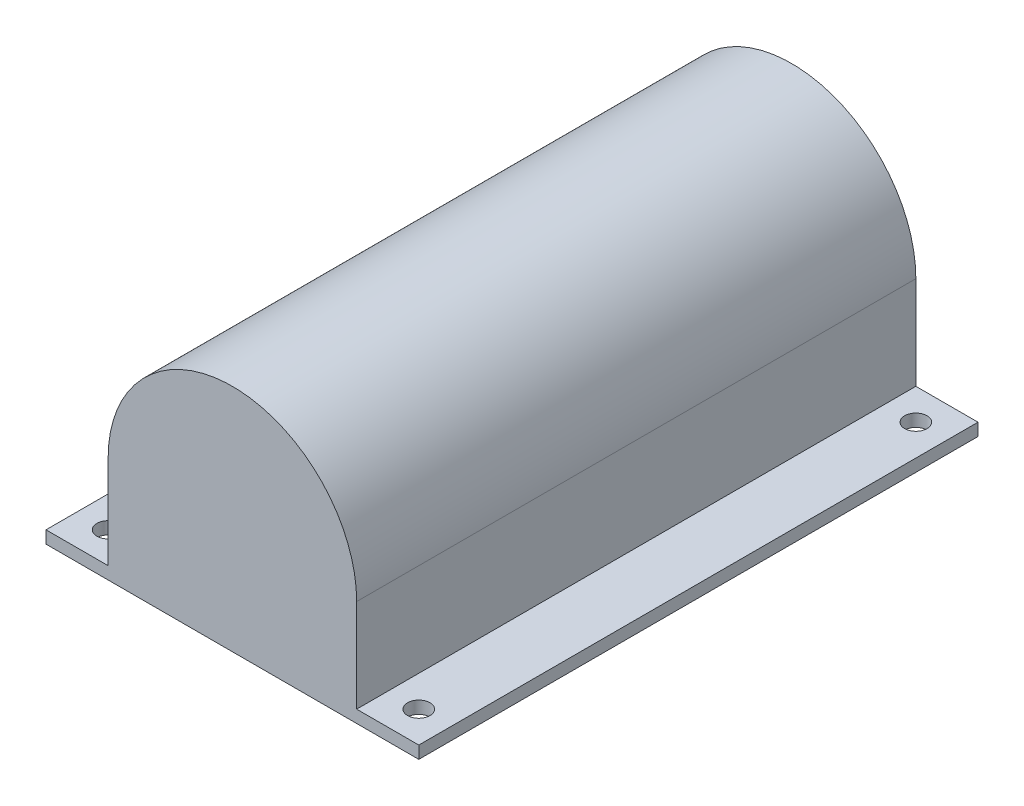
ISO-10303-21;
HEADER;
FILE_DESCRIPTION(('STEP AP214'),'2;1');
FILE_NAME('part.step','',(''),(''),'','','');
FILE_SCHEMA(('AUTOMOTIVE_DESIGN { 1 0 10303 214 1 1 1 1 }'));
ENDSEC;
DATA;
#1=APPLICATION_CONTEXT('core data for automotive mechanical design processes');
#2=APPLICATION_PROTOCOL_DEFINITION('international standard','automotive_design',2000,#1);
#3=PRODUCT_CONTEXT('',#1,'mechanical');
#4=PRODUCT('Part','Part','',(#3));
#5=PRODUCT_RELATED_PRODUCT_CATEGORY('part','',(#4));
#6=PRODUCT_DEFINITION_FORMATION('','',#4);
#7=PRODUCT_DEFINITION_CONTEXT('part definition',#1,'design');
#8=PRODUCT_DEFINITION('design','',#6,#7);
#9=PRODUCT_DEFINITION_SHAPE('','',#8);
#10=(LENGTH_UNIT() NAMED_UNIT(*) SI_UNIT(.MILLI.,.METRE.));
#11=(NAMED_UNIT(*) PLANE_ANGLE_UNIT() SI_UNIT($,.RADIAN.));
#12=(NAMED_UNIT(*) SI_UNIT($,.STERADIAN.) SOLID_ANGLE_UNIT());
#13=UNCERTAINTY_MEASURE_WITH_UNIT(LENGTH_MEASURE(1.E-05),#10,'distance_accuracy_value','');
#14=(GEOMETRIC_REPRESENTATION_CONTEXT(3) GLOBAL_UNCERTAINTY_ASSIGNED_CONTEXT((#13)) GLOBAL_UNIT_ASSIGNED_CONTEXT((#10,
#11,#12)) REPRESENTATION_CONTEXT('',''));
#15=CARTESIAN_POINT('',(0.,0.,0.));
#16=DIRECTION('',(0.,0.,1.));
#17=DIRECTION('',(1.,0.,0.));
#18=AXIS2_PLACEMENT_3D('',#15,#16,#17);
#19=CARTESIAN_POINT('',(0.,2.54,114.3));
#20=DIRECTION('',(0.,1.,0.));
#21=DIRECTION('',(0.,0.,1.));
#22=AXIS2_PLACEMENT_3D('',#19,#20,#21);
#23=PLANE('',#22);
#24=CARTESIAN_POINT('',(6.35,2.54,25.4));
#25=DIRECTION('',(0.,1.,0.));
#26=DIRECTION('',(0.,0.,1.));
#27=AXIS2_PLACEMENT_3D('',#24,#25,#26);
#28=CIRCLE('',#27,3.175);
#29=CARTESIAN_POINT('',(6.35,2.54,28.575));
#30=VERTEX_POINT('',#29);
#31=EDGE_CURVE('E274',#30,#30,#28,.T.);
#32=ORIENTED_EDGE('',*,*,#31,.F.);
#33=EDGE_LOOP('',(#32));
#34=FACE_BOUND('',#33,.T.);
#35=CARTESIAN_POINT('',(6.35,2.54,78.74));
#36=DIRECTION('',(0.,1.,0.));
#37=DIRECTION('',(0.,0.,1.));
#38=AXIS2_PLACEMENT_3D('',#35,#36,#37);
#39=CIRCLE('',#38,2.49999995300001);
#40=CARTESIAN_POINT('',(6.35,2.54,81.239999953));
#41=VERTEX_POINT('',#40);
#42=EDGE_CURVE('E293',#41,#41,#39,.T.);
#43=ORIENTED_EDGE('',*,*,#42,.F.);
#44=EDGE_LOOP('',(#43));
#45=FACE_BOUND('',#44,.T.);
#46=CARTESIAN_POINT('',(6.35,2.54,68.58));
#47=DIRECTION('',(0.,1.,0.));
#48=DIRECTION('',(0.,0.,1.));
#49=AXIS2_PLACEMENT_3D('',#46,#47,#48);
#50=CIRCLE('',#49,2.49999995300001);
#51=CARTESIAN_POINT('',(6.35,2.54,71.079999953));
#52=VERTEX_POINT('',#51);
#53=EDGE_CURVE('E290',#52,#52,#50,.T.);
#54=ORIENTED_EDGE('',*,*,#53,.F.);
#55=EDGE_LOOP('',(#54));
#56=FACE_BOUND('',#55,.T.);
#57=CARTESIAN_POINT('',(6.35,2.54,58.42));
#58=DIRECTION('',(0.,1.,0.));
#59=DIRECTION('',(0.,0.,1.));
#60=AXIS2_PLACEMENT_3D('',#57,#58,#59);
#61=CIRCLE('',#60,2.499999953);
#62=CARTESIAN_POINT('',(6.35,2.54,60.919999953));
#63=VERTEX_POINT('',#62);
#64=EDGE_CURVE('E282',#63,#63,#61,.T.);
#65=ORIENTED_EDGE('',*,*,#64,.F.);
#66=EDGE_LOOP('',(#65));
#67=FACE_BOUND('',#66,.T.);
#68=CARTESIAN_POINT('',(6.35,2.54,88.9));
#69=DIRECTION('',(0.,1.,0.));
#70=DIRECTION('',(0.,0.,1.));
#71=AXIS2_PLACEMENT_3D('',#68,#69,#70);
#72=CIRCLE('',#71,2.499999953);
#73=CARTESIAN_POINT('',(6.35,2.54,91.399999953));
#74=VERTEX_POINT('',#73);
#75=EDGE_CURVE('E299',#74,#74,#72,.T.);
#76=ORIENTED_EDGE('',*,*,#75,.F.);
#77=EDGE_LOOP('',(#76));
#78=FACE_BOUND('',#77,.T.);
#79=CARTESIAN_POINT('',(6.35,2.54,107.95));
#80=DIRECTION('',(0.,1.,0.));
#81=DIRECTION('',(0.,0.,1.));
#82=AXIS2_PLACEMENT_3D('',#79,#80,#81);
#83=CIRCLE('',#82,2.286);
#84=CARTESIAN_POINT('',(6.35,2.54,110.236));
#85=VERTEX_POINT('',#84);
#86=EDGE_CURVE('E327',#85,#85,#83,.T.);
#87=ORIENTED_EDGE('',*,*,#86,.F.);
#88=EDGE_LOOP('',(#87));
#89=FACE_BOUND('',#88,.T.);
#90=CARTESIAN_POINT('',(6.35,2.54,6.34999999999999));
#91=DIRECTION('',(0.,1.,0.));
#92=DIRECTION('',(0.,0.,1.));
#93=AXIS2_PLACEMENT_3D('',#90,#91,#92);
#94=CIRCLE('',#93,2.286);
#95=CARTESIAN_POINT('',(6.35,2.54,8.63599999999999));
#96=VERTEX_POINT('',#95);
#97=EDGE_CURVE('E338',#96,#96,#94,.T.);
#98=ORIENTED_EDGE('',*,*,#97,.F.);
#99=EDGE_LOOP('',(#98));
#100=FACE_BOUND('',#99,.T.);
#101=DIRECTION('',(1.,0.,0.));
#102=VECTOR('',#101,1.);
#103=CARTESIAN_POINT('',(0.,2.54,0.));
#104=LINE('',#103,#102);
#105=CARTESIAN_POINT('',(0.,2.54,0.));
#106=VERTEX_POINT('',#105);
#107=CARTESIAN_POINT('',(12.7,2.54,0.));
#108=VERTEX_POINT('',#107);
#109=EDGE_CURVE('E143',#106,#108,#104,.T.);
#110=ORIENTED_EDGE('',*,*,#109,.F.);
#111=DIRECTION('',(0.,0.,-1.));
#112=VECTOR('',#111,1.);
#113=CARTESIAN_POINT('',(0.,2.54,114.3));
#114=LINE('',#113,#112);
#115=CARTESIAN_POINT('',(0.,2.54,114.3));
#116=VERTEX_POINT('',#115);
#117=EDGE_CURVE('E11',#116,#106,#114,.T.);
#118=ORIENTED_EDGE('',*,*,#117,.F.);
#119=DIRECTION('',(1.,0.,0.));
#120=VECTOR('',#119,1.);
#121=CARTESIAN_POINT('',(0.,2.54,114.3));
#122=LINE('',#121,#120);
#123=CARTESIAN_POINT('',(12.7,2.54,114.3));
#124=VERTEX_POINT('',#123);
#125=EDGE_CURVE('E164',#116,#124,#122,.T.);
#126=ORIENTED_EDGE('',*,*,#125,.T.);
#127=DIRECTION('',(0.,0.,-1.));
#128=VECTOR('',#127,1.);
#129=CARTESIAN_POINT('',(12.7,2.54,114.3));
#130=LINE('',#129,#128);
#131=EDGE_CURVE('E36',#124,#108,#130,.T.);
#132=ORIENTED_EDGE('',*,*,#131,.T.);
#133=EDGE_LOOP('',(#110,#118,#126,#132));
#134=FACE_BOUND('',#133,.T.);
#135=ADVANCED_FACE('F33',(#34,#45,#56,#67,#78,#89,#100,#134),#23,.T.);
#136=CARTESIAN_POINT('',(0.,0.,114.3));
#137=DIRECTION('',(-1.,0.,0.));
#138=DIRECTION('',(0.,0.,1.));
#139=AXIS2_PLACEMENT_3D('',#136,#137,#138);
#140=PLANE('',#139);
#141=DIRECTION('',(0.,1.,0.));
#142=VECTOR('',#141,1.);
#143=CARTESIAN_POINT('',(0.,0.,0.));
#144=LINE('',#143,#142);
#145=CARTESIAN_POINT('',(0.,0.,0.));
#146=VERTEX_POINT('',#145);
#147=EDGE_CURVE('E162',#146,#106,#144,.T.);
#148=ORIENTED_EDGE('',*,*,#147,.F.);
#149=DIRECTION('',(0.,0.,-1.));
#150=VECTOR('',#149,1.);
#151=CARTESIAN_POINT('',(0.,0.,114.3));
#152=LINE('',#151,#150);
#153=CARTESIAN_POINT('',(0.,0.,114.3));
#154=VERTEX_POINT('',#153);
#155=EDGE_CURVE('E41',#154,#146,#152,.T.);
#156=ORIENTED_EDGE('',*,*,#155,.F.);
#157=DIRECTION('',(0.,1.,0.));
#158=VECTOR('',#157,1.);
#159=CARTESIAN_POINT('',(0.,0.,114.3));
#160=LINE('',#159,#158);
#161=EDGE_CURVE('E121',#154,#116,#160,.T.);
#162=ORIENTED_EDGE('',*,*,#161,.T.);
#163=ORIENTED_EDGE('',*,*,#117,.T.);
#164=EDGE_LOOP('',(#148,#156,#162,#163));
#165=FACE_BOUND('',#164,.T.);
#166=ADVANCED_FACE('F177',(#165),#140,.T.);
#167=CARTESIAN_POINT('',(0.,0.,114.3));
#168=DIRECTION('',(0.,1.,0.));
#169=DIRECTION('',(0.,0.,1.));
#170=AXIS2_PLACEMENT_3D('',#167,#168,#169);
#171=PLANE('',#170);
#172=CARTESIAN_POINT('',(6.35,0.,25.4));
#173=DIRECTION('',(0.,1.,0.));
#174=DIRECTION('',(0.,0.,1.));
#175=AXIS2_PLACEMENT_3D('',#172,#173,#174);
#176=CIRCLE('',#175,3.175);
#177=CARTESIAN_POINT('',(6.35,0.,28.575));
#178=VERTEX_POINT('',#177);
#179=EDGE_CURVE('E271',#178,#178,#176,.T.);
#180=ORIENTED_EDGE('',*,*,#179,.T.);
#181=EDGE_LOOP('',(#180));
#182=FACE_BOUND('',#181,.T.);
#183=CARTESIAN_POINT('',(6.35,0.,78.74));
#184=DIRECTION('',(0.,-1.,0.));
#185=DIRECTION('',(0.,0.,-1.));
#186=AXIS2_PLACEMENT_3D('',#183,#184,#185);
#187=CIRCLE('',#186,2.49999995300001);
#188=CARTESIAN_POINT('',(6.35,0.,76.240000047));
#189=VERTEX_POINT('',#188);
#190=EDGE_CURVE('E279',#189,#189,#187,.T.);
#191=ORIENTED_EDGE('',*,*,#190,.F.);
#192=EDGE_LOOP('',(#191));
#193=FACE_BOUND('',#192,.T.);
#194=CARTESIAN_POINT('',(6.35,0.,68.58));
#195=DIRECTION('',(0.,-1.,0.));
#196=DIRECTION('',(0.,0.,-1.));
#197=AXIS2_PLACEMENT_3D('',#194,#195,#196);
#198=CIRCLE('',#197,2.49999995300001);
#199=CARTESIAN_POINT('',(6.35,0.,66.080000047));
#200=VERTEX_POINT('',#199);
#201=EDGE_CURVE('E283',#200,#200,#198,.T.);
#202=ORIENTED_EDGE('',*,*,#201,.F.);
#203=EDGE_LOOP('',(#202));
#204=FACE_BOUND('',#203,.T.);
#205=CARTESIAN_POINT('',(6.35,0.,58.42));
#206=DIRECTION('',(0.,-1.,0.));
#207=DIRECTION('',(0.,0.,-1.));
#208=AXIS2_PLACEMENT_3D('',#205,#206,#207);
#209=CIRCLE('',#208,2.499999953);
#210=CARTESIAN_POINT('',(6.35,0.,55.920000047));
#211=VERTEX_POINT('',#210);
#212=EDGE_CURVE('E276',#211,#211,#209,.T.);
#213=ORIENTED_EDGE('',*,*,#212,.F.);
#214=EDGE_LOOP('',(#213));
#215=FACE_BOUND('',#214,.T.);
#216=CARTESIAN_POINT('',(6.35,0.,88.9));
#217=DIRECTION('',(0.,-1.,0.));
#218=DIRECTION('',(0.,0.,-1.));
#219=AXIS2_PLACEMENT_3D('',#216,#217,#218);
#220=CIRCLE('',#219,2.499999953);
#221=CARTESIAN_POINT('',(6.35,0.,86.400000047));
#222=VERTEX_POINT('',#221);
#223=EDGE_CURVE('E296',#222,#222,#220,.T.);
#224=ORIENTED_EDGE('',*,*,#223,.F.);
#225=EDGE_LOOP('',(#224));
#226=FACE_BOUND('',#225,.T.);
#227=CARTESIAN_POINT('',(69.85,0.,6.34999999999999));
#228=DIRECTION('',(0.,1.,0.));
#229=DIRECTION('',(0.,0.,1.));
#230=AXIS2_PLACEMENT_3D('',#227,#228,#229);
#231=CIRCLE('',#230,2.28599999999999);
#232=CARTESIAN_POINT('',(69.85,0.,8.63599999999999));
#233=VERTEX_POINT('',#232);
#234=EDGE_CURVE('E335',#233,#233,#231,.T.);
#235=ORIENTED_EDGE('',*,*,#234,.T.);
#236=EDGE_LOOP('',(#235));
#237=FACE_BOUND('',#236,.T.);
#238=CARTESIAN_POINT('',(69.85,0.,107.95));
#239=DIRECTION('',(0.,1.,0.));
#240=DIRECTION('',(0.,0.,1.));
#241=AXIS2_PLACEMENT_3D('',#238,#239,#240);
#242=CIRCLE('',#241,2.28599999999999);
#243=CARTESIAN_POINT('',(69.85,0.,110.236));
#244=VERTEX_POINT('',#243);
#245=EDGE_CURVE('E342',#244,#244,#242,.T.);
#246=ORIENTED_EDGE('',*,*,#245,.T.);
#247=EDGE_LOOP('',(#246));
#248=FACE_BOUND('',#247,.T.);
#249=CARTESIAN_POINT('',(6.35,0.,107.95));
#250=DIRECTION('',(0.,1.,0.));
#251=DIRECTION('',(0.,0.,1.));
#252=AXIS2_PLACEMENT_3D('',#249,#250,#251);
#253=CIRCLE('',#252,2.286);
#254=CARTESIAN_POINT('',(6.35,0.,110.236));
#255=VERTEX_POINT('',#254);
#256=EDGE_CURVE('E348',#255,#255,#253,.T.);
#257=ORIENTED_EDGE('',*,*,#256,.T.);
#258=EDGE_LOOP('',(#257));
#259=FACE_BOUND('',#258,.T.);
#260=CARTESIAN_POINT('',(6.35,0.,6.34999999999999));
#261=DIRECTION('',(0.,1.,0.));
#262=DIRECTION('',(0.,0.,1.));
#263=AXIS2_PLACEMENT_3D('',#260,#261,#262);
#264=CIRCLE('',#263,2.286);
#265=CARTESIAN_POINT('',(6.35,0.,8.63599999999999));
#266=VERTEX_POINT('',#265);
#267=EDGE_CURVE('E147',#266,#266,#264,.T.);
#268=ORIENTED_EDGE('',*,*,#267,.T.);
#269=EDGE_LOOP('',(#268));
#270=FACE_BOUND('',#269,.T.);
#271=DIRECTION('',(1.,0.,0.));
#272=VECTOR('',#271,1.);
#273=CARTESIAN_POINT('',(0.,0.,0.));
#274=LINE('',#273,#272);
#275=CARTESIAN_POINT('',(76.2,0.,0.));
#276=VERTEX_POINT('',#275);
#277=EDGE_CURVE('E128',#146,#276,#274,.T.);
#278=ORIENTED_EDGE('',*,*,#277,.T.);
#279=DIRECTION('',(0.,0.,-1.));
#280=VECTOR('',#279,1.);
#281=CARTESIAN_POINT('',(76.2,0.,114.3));
#282=LINE('',#281,#280);
#283=CARTESIAN_POINT('',(76.2,0.,114.3));
#284=VERTEX_POINT('',#283);
#285=EDGE_CURVE('E125',#284,#276,#282,.T.);
#286=ORIENTED_EDGE('',*,*,#285,.F.);
#287=DIRECTION('',(1.,0.,0.));
#288=VECTOR('',#287,1.);
#289=CARTESIAN_POINT('',(0.,0.,114.3));
#290=LINE('',#289,#288);
#291=EDGE_CURVE('E114',#154,#284,#290,.T.);
#292=ORIENTED_EDGE('',*,*,#291,.F.);
#293=ORIENTED_EDGE('',*,*,#155,.T.);
#294=EDGE_LOOP('',(#278,#286,#292,#293));
#295=FACE_BOUND('',#294,.T.);
#296=ADVANCED_FACE('F126',(#182,#193,#204,#215,#226,#237,#248,#259,#270,#295),#171,.F.);
#297=CARTESIAN_POINT('',(76.2,0.,114.3));
#298=DIRECTION('',(-1.,0.,0.));
#299=DIRECTION('',(0.,0.,1.));
#300=AXIS2_PLACEMENT_3D('',#297,#298,#299);
#301=PLANE('',#300);
#302=DIRECTION('',(0.,1.,0.));
#303=VECTOR('',#302,1.);
#304=CARTESIAN_POINT('',(76.2,0.,0.));
#305=LINE('',#304,#303);
#306=CARTESIAN_POINT('',(76.2,2.54,0.));
#307=VERTEX_POINT('',#306);
#308=EDGE_CURVE('E159',#276,#307,#305,.T.);
#309=ORIENTED_EDGE('',*,*,#308,.T.);
#310=DIRECTION('',(0.,0.,-1.));
#311=VECTOR('',#310,1.);
#312=CARTESIAN_POINT('',(76.2,2.54,114.3));
#313=LINE('',#312,#311);
#314=CARTESIAN_POINT('',(76.2,2.54,114.3));
#315=VERTEX_POINT('',#314);
#316=EDGE_CURVE('E132',#315,#307,#313,.T.);
#317=ORIENTED_EDGE('',*,*,#316,.F.);
#318=DIRECTION('',(0.,1.,0.));
#319=VECTOR('',#318,1.);
#320=CARTESIAN_POINT('',(76.2,0.,114.3));
#321=LINE('',#320,#319);
#322=EDGE_CURVE('E119',#284,#315,#321,.T.);
#323=ORIENTED_EDGE('',*,*,#322,.F.);
#324=ORIENTED_EDGE('',*,*,#285,.T.);
#325=EDGE_LOOP('',(#309,#317,#323,#324));
#326=FACE_BOUND('',#325,.T.);
#327=ADVANCED_FACE('F134',(#326),#301,.F.);
#328=CARTESIAN_POINT('',(63.5,2.54,114.3));
#329=DIRECTION('',(0.,1.,0.));
#330=DIRECTION('',(-1.,0.,0.));
#331=AXIS2_PLACEMENT_3D('',#328,#329,#330);
#332=PLANE('',#331);
#333=CARTESIAN_POINT('',(69.85,2.54,6.34999999999999));
#334=DIRECTION('',(0.,1.,0.));
#335=DIRECTION('',(0.,0.,1.));
#336=AXIS2_PLACEMENT_3D('',#333,#334,#335);
#337=CIRCLE('',#336,2.28599999999999);
#338=CARTESIAN_POINT('',(69.85,2.54,8.63599999999999));
#339=VERTEX_POINT('',#338);
#340=EDGE_CURVE('E339',#339,#339,#337,.T.);
#341=ORIENTED_EDGE('',*,*,#340,.F.);
#342=EDGE_LOOP('',(#341));
#343=FACE_BOUND('',#342,.T.);
#344=CARTESIAN_POINT('',(69.85,2.54,107.95));
#345=DIRECTION('',(0.,1.,0.));
#346=DIRECTION('',(0.,0.,1.));
#347=AXIS2_PLACEMENT_3D('',#344,#345,#346);
#348=CIRCLE('',#347,2.28599999999999);
#349=CARTESIAN_POINT('',(69.85,2.54,110.236));
#350=VERTEX_POINT('',#349);
#351=EDGE_CURVE('E345',#350,#350,#348,.T.);
#352=ORIENTED_EDGE('',*,*,#351,.F.);
#353=EDGE_LOOP('',(#352));
#354=FACE_BOUND('',#353,.T.);
#355=DIRECTION('',(1.,0.,0.));
#356=VECTOR('',#355,1.);
#357=CARTESIAN_POINT('',(63.5,2.54,0.));
#358=LINE('',#357,#356);
#359=CARTESIAN_POINT('',(63.5,2.54,0.));
#360=VERTEX_POINT('',#359);
#361=EDGE_CURVE('E156',#360,#307,#358,.T.);
#362=ORIENTED_EDGE('',*,*,#361,.F.);
#363=DIRECTION('',(0.,0.,-1.));
#364=VECTOR('',#363,1.);
#365=CARTESIAN_POINT('',(63.5,2.54,114.3));
#366=LINE('',#365,#364);
#367=CARTESIAN_POINT('',(63.5,2.54,114.3));
#368=VERTEX_POINT('',#367);
#369=EDGE_CURVE('E168',#368,#360,#366,.T.);
#370=ORIENTED_EDGE('',*,*,#369,.F.);
#371=DIRECTION('',(1.,0.,0.));
#372=VECTOR('',#371,1.);
#373=CARTESIAN_POINT('',(63.5,2.54,114.3));
#374=LINE('',#373,#372);
#375=EDGE_CURVE('E136',#368,#315,#374,.T.);
#376=ORIENTED_EDGE('',*,*,#375,.T.);
#377=ORIENTED_EDGE('',*,*,#316,.T.);
#378=EDGE_LOOP('',(#362,#370,#376,#377));
#379=FACE_BOUND('',#378,.T.);
#380=ADVANCED_FACE('F192',(#343,#354,#379),#332,.T.);
#381=CARTESIAN_POINT('',(63.5,21.59,114.3));
#382=DIRECTION('',(1.,0.,0.));
#383=DIRECTION('',(0.,0.,-1.));
#384=AXIS2_PLACEMENT_3D('',#381,#382,#383);
#385=PLANE('',#384);
#386=DIRECTION('',(0.,-1.,0.));
#387=VECTOR('',#386,1.);
#388=CARTESIAN_POINT('',(63.5,21.59,0.));
#389=LINE('',#388,#387);
#390=CARTESIAN_POINT('',(63.5,21.59,0.));
#391=VERTEX_POINT('',#390);
#392=EDGE_CURVE('E153',#391,#360,#389,.T.);
#393=ORIENTED_EDGE('',*,*,#392,.F.);
#394=DIRECTION('',(0.,0.,-1.));
#395=VECTOR('',#394,1.);
#396=CARTESIAN_POINT('',(63.5,21.59,114.3));
#397=LINE('',#396,#395);
#398=CARTESIAN_POINT('',(63.5,21.59,114.3));
#399=VERTEX_POINT('',#398);
#400=EDGE_CURVE('E170',#399,#391,#397,.T.);
#401=ORIENTED_EDGE('',*,*,#400,.F.);
#402=DIRECTION('',(0.,-1.,0.));
#403=VECTOR('',#402,1.);
#404=CARTESIAN_POINT('',(63.5,21.59,114.3));
#405=LINE('',#404,#403);
#406=EDGE_CURVE('E138',#399,#368,#405,.T.);
#407=ORIENTED_EDGE('',*,*,#406,.T.);
#408=ORIENTED_EDGE('',*,*,#369,.T.);
#409=EDGE_LOOP('',(#393,#401,#407,#408));
#410=FACE_BOUND('',#409,.T.);
#411=ADVANCED_FACE('F195',(#410),#385,.T.);
#412=CARTESIAN_POINT('',(38.1,21.59,114.3));
#413=DIRECTION('',(0.,0.,-1.));
#414=DIRECTION('',(-1.,0.,0.));
#415=AXIS2_PLACEMENT_3D('',#412,#413,#414);
#416=CYLINDRICAL_SURFACE('',#415,25.4);
#417=CARTESIAN_POINT('',(38.1,21.59,0.));
#418=DIRECTION('',(0.,0.,1.));
#419=DIRECTION('',(1.,0.,0.));
#420=AXIS2_PLACEMENT_3D('',#417,#418,#419);
#421=CIRCLE('',#420,25.4);
#422=CARTESIAN_POINT('',(12.7,21.59,0.));
#423=VERTEX_POINT('',#422);
#424=EDGE_CURVE('E150',#391,#423,#421,.T.);
#425=ORIENTED_EDGE('',*,*,#424,.T.);
#426=DIRECTION('',(0.,0.,-1.));
#427=VECTOR('',#426,1.);
#428=CARTESIAN_POINT('',(12.7,21.59,114.3));
#429=LINE('',#428,#427);
#430=CARTESIAN_POINT('',(12.7,21.59,114.3));
#431=VERTEX_POINT('',#430);
#432=EDGE_CURVE('E171',#431,#423,#429,.T.);
#433=ORIENTED_EDGE('',*,*,#432,.F.);
#434=CARTESIAN_POINT('',(38.1,21.59,114.3));
#435=DIRECTION('',(0.,0.,1.));
#436=DIRECTION('',(1.,0.,0.));
#437=AXIS2_PLACEMENT_3D('',#434,#435,#436);
#438=CIRCLE('',#437,25.4);
#439=EDGE_CURVE('E360',#399,#431,#438,.T.);
#440=ORIENTED_EDGE('',*,*,#439,.F.);
#441=ORIENTED_EDGE('',*,*,#400,.T.);
#442=EDGE_LOOP('',(#425,#433,#440,#441));
#443=FACE_BOUND('',#442,.T.);
#444=ADVANCED_FACE('F199',(#443),#416,.T.);
#445=CARTESIAN_POINT('',(12.7,2.54,114.3));
#446=DIRECTION('',(-1.,0.,0.));
#447=DIRECTION('',(0.,0.,1.));
#448=AXIS2_PLACEMENT_3D('',#445,#446,#447);
#449=PLANE('',#448);
#450=DIRECTION('',(0.,1.,0.));
#451=VECTOR('',#450,1.);
#452=CARTESIAN_POINT('',(12.7,2.54,0.));
#453=LINE('',#452,#451);
#454=EDGE_CURVE('E146',#108,#423,#453,.T.);
#455=ORIENTED_EDGE('',*,*,#454,.F.);
#456=ORIENTED_EDGE('',*,*,#131,.F.);
#457=DIRECTION('',(0.,1.,0.));
#458=VECTOR('',#457,1.);
#459=CARTESIAN_POINT('',(12.7,2.54,114.3));
#460=LINE('',#459,#458);
#461=EDGE_CURVE('E358',#124,#431,#460,.T.);
#462=ORIENTED_EDGE('',*,*,#461,.T.);
#463=ORIENTED_EDGE('',*,*,#432,.T.);
#464=EDGE_LOOP('',(#455,#456,#462,#463));
#465=FACE_BOUND('',#464,.T.);
#466=ADVANCED_FACE('F173',(#465),#449,.T.);
#467=CARTESIAN_POINT('',(38.1,21.59,114.3));
#468=DIRECTION('',(0.,0.,1.));
#469=DIRECTION('',(1.,0.,0.));
#470=AXIS2_PLACEMENT_3D('',#467,#468,#469);
#471=PLANE('',#470);
#472=ORIENTED_EDGE('',*,*,#125,.F.);
#473=ORIENTED_EDGE('',*,*,#161,.F.);
#474=ORIENTED_EDGE('',*,*,#291,.T.);
#475=ORIENTED_EDGE('',*,*,#322,.T.);
#476=ORIENTED_EDGE('',*,*,#375,.F.);
#477=ORIENTED_EDGE('',*,*,#406,.F.);
#478=ORIENTED_EDGE('',*,*,#439,.T.);
#479=ORIENTED_EDGE('',*,*,#461,.F.);
#480=EDGE_LOOP('',(#472,#473,#474,#475,#476,#477,#478,#479));
#481=FACE_BOUND('',#480,.T.);
#482=ADVANCED_FACE('F116',(#481),#471,.T.);
#483=CARTESIAN_POINT('',(38.1,21.59,0.));
#484=DIRECTION('',(0.,0.,1.));
#485=DIRECTION('',(1.,0.,0.));
#486=AXIS2_PLACEMENT_3D('',#483,#484,#485);
#487=PLANE('',#486);
#488=DIRECTION('',(-1.,0.,0.));
#489=VECTOR('',#488,1.);
#490=CARTESIAN_POINT('',(60.96,2.54,0.));
#491=LINE('',#490,#489);
#492=CARTESIAN_POINT('',(60.96,2.54,0.));
#493=VERTEX_POINT('',#492);
#494=CARTESIAN_POINT('',(15.24,2.54,0.));
#495=VERTEX_POINT('',#494);
#496=EDGE_CURVE('E317',#493,#495,#491,.T.);
#497=ORIENTED_EDGE('',*,*,#496,.F.);
#498=DIRECTION('',(0.,-1.,0.));
#499=VECTOR('',#498,1.);
#500=CARTESIAN_POINT('',(60.96,21.59,0.));
#501=LINE('',#500,#499);
#502=CARTESIAN_POINT('',(60.96,21.59,0.));
#503=VERTEX_POINT('',#502);
#504=EDGE_CURVE('E49',#503,#493,#501,.T.);
#505=ORIENTED_EDGE('',*,*,#504,.F.);
#506=CARTESIAN_POINT('',(38.1,21.59,0.));
#507=DIRECTION('',(0.,0.,-1.));
#508=DIRECTION('',(-1.,0.,0.));
#509=AXIS2_PLACEMENT_3D('',#506,#507,#508);
#510=CIRCLE('',#509,22.86);
#511=CARTESIAN_POINT('',(15.24,21.59,0.));
#512=VERTEX_POINT('',#511);
#513=EDGE_CURVE('E306',#512,#503,#510,.T.);
#514=ORIENTED_EDGE('',*,*,#513,.F.);
#515=DIRECTION('',(0.,1.,0.));
#516=VECTOR('',#515,1.);
#517=CARTESIAN_POINT('',(15.24,2.54,0.));
#518=LINE('',#517,#516);
#519=EDGE_CURVE('E320',#495,#512,#518,.T.);
#520=ORIENTED_EDGE('',*,*,#519,.F.);
#521=EDGE_LOOP('',(#497,#505,#514,#520));
#522=FACE_BOUND('',#521,.T.);
#523=ORIENTED_EDGE('',*,*,#109,.T.);
#524=ORIENTED_EDGE('',*,*,#454,.T.);
#525=ORIENTED_EDGE('',*,*,#424,.F.);
#526=ORIENTED_EDGE('',*,*,#392,.T.);
#527=ORIENTED_EDGE('',*,*,#361,.T.);
#528=ORIENTED_EDGE('',*,*,#308,.F.);
#529=ORIENTED_EDGE('',*,*,#277,.F.);
#530=ORIENTED_EDGE('',*,*,#147,.T.);
#531=EDGE_LOOP('',(#523,#524,#525,#526,#527,#528,#529,#530));
#532=FACE_BOUND('',#531,.T.);
#533=ADVANCED_FACE('F176',(#522,#532),#487,.F.);
#534=CARTESIAN_POINT('',(6.35,0.,6.34999999999999));
#535=DIRECTION('',(0.,1.,0.));
#536=DIRECTION('',(0.,0.,1.));
#537=AXIS2_PLACEMENT_3D('',#534,#535,#536);
#538=CYLINDRICAL_SURFACE('',#537,2.286);
#539=ORIENTED_EDGE('',*,*,#267,.F.);
#540=EDGE_LOOP('',(#539));
#541=FACE_BOUND('',#540,.T.);
#542=ORIENTED_EDGE('',*,*,#97,.T.);
#543=EDGE_LOOP('',(#542));
#544=FACE_BOUND('',#543,.T.);
#545=ADVANCED_FACE('F210',(#541,#544),#538,.F.);
#546=CARTESIAN_POINT('',(69.85,0.,107.95));
#547=DIRECTION('',(0.,1.,0.));
#548=DIRECTION('',(0.,0.,1.));
#549=AXIS2_PLACEMENT_3D('',#546,#547,#548);
#550=CYLINDRICAL_SURFACE('',#549,2.28599999999999);
#551=ORIENTED_EDGE('',*,*,#245,.F.);
#552=EDGE_LOOP('',(#551));
#553=FACE_BOUND('',#552,.T.);
#554=ORIENTED_EDGE('',*,*,#351,.T.);
#555=EDGE_LOOP('',(#554));
#556=FACE_BOUND('',#555,.T.);
#557=ADVANCED_FACE('F215',(#553,#556),#550,.F.);
#558=CARTESIAN_POINT('',(69.85,0.,6.34999999999999));
#559=DIRECTION('',(0.,1.,0.));
#560=DIRECTION('',(0.,0.,1.));
#561=AXIS2_PLACEMENT_3D('',#558,#559,#560);
#562=CYLINDRICAL_SURFACE('',#561,2.28599999999999);
#563=ORIENTED_EDGE('',*,*,#234,.F.);
#564=EDGE_LOOP('',(#563));
#565=FACE_BOUND('',#564,.T.);
#566=ORIENTED_EDGE('',*,*,#340,.T.);
#567=EDGE_LOOP('',(#566));
#568=FACE_BOUND('',#567,.T.);
#569=ADVANCED_FACE('F221',(#565,#568),#562,.F.);
#570=CARTESIAN_POINT('',(6.35,0.,107.95));
#571=DIRECTION('',(0.,1.,0.));
#572=DIRECTION('',(0.,0.,1.));
#573=AXIS2_PLACEMENT_3D('',#570,#571,#572);
#574=CYLINDRICAL_SURFACE('',#573,2.286);
#575=ORIENTED_EDGE('',*,*,#256,.F.);
#576=EDGE_LOOP('',(#575));
#577=FACE_BOUND('',#576,.T.);
#578=ORIENTED_EDGE('',*,*,#86,.T.);
#579=EDGE_LOOP('',(#578));
#580=FACE_BOUND('',#579,.T.);
#581=ADVANCED_FACE('F217',(#577,#580),#574,.F.);
#582=CARTESIAN_POINT('',(60.96,21.59,114.046));
#583=DIRECTION('',(1.,0.,0.));
#584=DIRECTION('',(0.,1.,0.));
#585=AXIS2_PLACEMENT_3D('',#582,#583,#584);
#586=PLANE('',#585);
#587=ORIENTED_EDGE('',*,*,#504,.T.);
#588=DIRECTION('',(0.,0.,-1.));
#589=VECTOR('',#588,1.);
#590=CARTESIAN_POINT('',(60.96,2.54,114.046));
#591=LINE('',#590,#589);
#592=CARTESIAN_POINT('',(60.96,2.54,114.046));
#593=VERTEX_POINT('',#592);
#594=EDGE_CURVE('E315',#593,#493,#591,.T.);
#595=ORIENTED_EDGE('',*,*,#594,.F.);
#596=DIRECTION('',(0.,-1.,0.));
#597=VECTOR('',#596,1.);
#598=CARTESIAN_POINT('',(60.96,21.59,114.046));
#599=LINE('',#598,#597);
#600=CARTESIAN_POINT('',(60.96,21.59,114.046));
#601=VERTEX_POINT('',#600);
#602=EDGE_CURVE('E302',#601,#593,#599,.T.);
#603=ORIENTED_EDGE('',*,*,#602,.F.);
#604=DIRECTION('',(0.,0.,-1.));
#605=VECTOR('',#604,1.);
#606=CARTESIAN_POINT('',(60.96,21.59,114.046));
#607=LINE('',#606,#605);
#608=EDGE_CURVE('E325',#601,#503,#607,.T.);
#609=ORIENTED_EDGE('',*,*,#608,.T.);
#610=EDGE_LOOP('',(#587,#595,#603,#609));
#611=FACE_BOUND('',#610,.T.);
#612=ADVANCED_FACE('F220',(#611),#586,.F.);
#613=CARTESIAN_POINT('',(38.1,21.59,114.046));
#614=DIRECTION('',(0.,0.,-1.));
#615=DIRECTION('',(-1.,0.,0.));
#616=AXIS2_PLACEMENT_3D('',#613,#614,#615);
#617=CYLINDRICAL_SURFACE('',#616,22.86);
#618=ORIENTED_EDGE('',*,*,#513,.T.);
#619=ORIENTED_EDGE('',*,*,#608,.F.);
#620=CARTESIAN_POINT('',(38.1,21.59,114.046));
#621=DIRECTION('',(0.,0.,-1.));
#622=DIRECTION('',(-1.,0.,0.));
#623=AXIS2_PLACEMENT_3D('',#620,#621,#622);
#624=CIRCLE('',#623,22.86);
#625=CARTESIAN_POINT('',(15.24,21.59,114.046));
#626=VERTEX_POINT('',#625);
#627=EDGE_CURVE('E312',#626,#601,#624,.T.);
#628=ORIENTED_EDGE('',*,*,#627,.F.);
#629=DIRECTION('',(0.,0.,-1.));
#630=VECTOR('',#629,1.);
#631=CARTESIAN_POINT('',(15.24,21.59,114.046));
#632=LINE('',#631,#630);
#633=EDGE_CURVE('E328',#626,#512,#632,.T.);
#634=ORIENTED_EDGE('',*,*,#633,.T.);
#635=EDGE_LOOP('',(#618,#619,#628,#634));
#636=FACE_BOUND('',#635,.T.);
#637=ADVANCED_FACE('F231',(#636),#617,.F.);
#638=CARTESIAN_POINT('',(15.24,2.54,114.046));
#639=DIRECTION('',(-1.,0.,0.));
#640=DIRECTION('',(0.,0.,1.));
#641=AXIS2_PLACEMENT_3D('',#638,#639,#640);
#642=PLANE('',#641);
#643=ORIENTED_EDGE('',*,*,#519,.T.);
#644=ORIENTED_EDGE('',*,*,#633,.F.);
#645=DIRECTION('',(0.,1.,0.));
#646=VECTOR('',#645,1.);
#647=CARTESIAN_POINT('',(15.24,2.54,114.046));
#648=LINE('',#647,#646);
#649=CARTESIAN_POINT('',(15.24,2.54,114.046));
#650=VERTEX_POINT('',#649);
#651=EDGE_CURVE('E309',#650,#626,#648,.T.);
#652=ORIENTED_EDGE('',*,*,#651,.F.);
#653=DIRECTION('',(0.,0.,-1.));
#654=VECTOR('',#653,1.);
#655=CARTESIAN_POINT('',(15.24,2.54,114.046));
#656=LINE('',#655,#654);
#657=EDGE_CURVE('E331',#650,#495,#656,.T.);
#658=ORIENTED_EDGE('',*,*,#657,.T.);
#659=EDGE_LOOP('',(#643,#644,#652,#658));
#660=FACE_BOUND('',#659,.T.);
#661=ADVANCED_FACE('F236',(#660),#642,.F.);
#662=CARTESIAN_POINT('',(60.96,2.54,114.046));
#663=DIRECTION('',(0.,-1.,0.));
#664=DIRECTION('',(0.,0.,-1.));
#665=AXIS2_PLACEMENT_3D('',#662,#663,#664);
#666=PLANE('',#665);
#667=ORIENTED_EDGE('',*,*,#496,.T.);
#668=ORIENTED_EDGE('',*,*,#657,.F.);
#669=DIRECTION('',(-1.,0.,0.));
#670=VECTOR('',#669,1.);
#671=CARTESIAN_POINT('',(60.96,2.54,114.046));
#672=LINE('',#671,#670);
#673=EDGE_CURVE('E305',#593,#650,#672,.T.);
#674=ORIENTED_EDGE('',*,*,#673,.F.);
#675=ORIENTED_EDGE('',*,*,#594,.T.);
#676=EDGE_LOOP('',(#667,#668,#674,#675));
#677=FACE_BOUND('',#676,.T.);
#678=ADVANCED_FACE('F232',(#677),#666,.F.);
#679=CARTESIAN_POINT('',(38.1,21.59,114.046));
#680=DIRECTION('',(0.,0.,-1.));
#681=DIRECTION('',(-1.,0.,0.));
#682=AXIS2_PLACEMENT_3D('',#679,#680,#681);
#683=PLANE('',#682);
#684=ORIENTED_EDGE('',*,*,#602,.T.);
#685=ORIENTED_EDGE('',*,*,#673,.T.);
#686=ORIENTED_EDGE('',*,*,#651,.T.);
#687=ORIENTED_EDGE('',*,*,#627,.T.);
#688=EDGE_LOOP('',(#684,#685,#686,#687));
#689=FACE_BOUND('',#688,.T.);
#690=ADVANCED_FACE('F235',(#689),#683,.T.);
#691=CARTESIAN_POINT('',(6.35,46.99,88.9));
#692=DIRECTION('',(0.,-1.,0.));
#693=DIRECTION('',(0.,0.,-1.));
#694=AXIS2_PLACEMENT_3D('',#691,#692,#693);
#695=CYLINDRICAL_SURFACE('',#694,2.499999953);
#696=ORIENTED_EDGE('',*,*,#75,.T.);
#697=EDGE_LOOP('',(#696));
#698=FACE_BOUND('',#697,.T.);
#699=ORIENTED_EDGE('',*,*,#223,.T.);
#700=EDGE_LOOP('',(#699));
#701=FACE_BOUND('',#700,.T.);
#702=ADVANCED_FACE('F246',(#698,#701),#695,.F.);
#703=CARTESIAN_POINT('',(6.35,46.99,58.42));
#704=DIRECTION('',(0.,-1.,0.));
#705=DIRECTION('',(0.,0.,-1.));
#706=AXIS2_PLACEMENT_3D('',#703,#704,#705);
#707=CYLINDRICAL_SURFACE('',#706,2.499999953);
#708=ORIENTED_EDGE('',*,*,#64,.T.);
#709=EDGE_LOOP('',(#708));
#710=FACE_BOUND('',#709,.T.);
#711=ORIENTED_EDGE('',*,*,#212,.T.);
#712=EDGE_LOOP('',(#711));
#713=FACE_BOUND('',#712,.T.);
#714=ADVANCED_FACE('F250',(#710,#713),#707,.F.);
#715=CARTESIAN_POINT('',(6.35,46.99,68.58));
#716=DIRECTION('',(0.,-1.,0.));
#717=DIRECTION('',(0.,0.,-1.));
#718=AXIS2_PLACEMENT_3D('',#715,#716,#717);
#719=CYLINDRICAL_SURFACE('',#718,2.49999995300001);
#720=ORIENTED_EDGE('',*,*,#53,.T.);
#721=EDGE_LOOP('',(#720));
#722=FACE_BOUND('',#721,.T.);
#723=ORIENTED_EDGE('',*,*,#201,.T.);
#724=EDGE_LOOP('',(#723));
#725=FACE_BOUND('',#724,.T.);
#726=ADVANCED_FACE('F254',(#722,#725),#719,.F.);
#727=CARTESIAN_POINT('',(6.35,46.99,78.74));
#728=DIRECTION('',(0.,-1.,0.));
#729=DIRECTION('',(0.,0.,-1.));
#730=AXIS2_PLACEMENT_3D('',#727,#728,#729);
#731=CYLINDRICAL_SURFACE('',#730,2.49999995300001);
#732=ORIENTED_EDGE('',*,*,#42,.T.);
#733=EDGE_LOOP('',(#732));
#734=FACE_BOUND('',#733,.T.);
#735=ORIENTED_EDGE('',*,*,#190,.T.);
#736=EDGE_LOOP('',(#735));
#737=FACE_BOUND('',#736,.T.);
#738=ADVANCED_FACE('F258',(#734,#737),#731,.F.);
#739=CARTESIAN_POINT('',(6.35,0.,25.4));
#740=DIRECTION('',(0.,1.,0.));
#741=DIRECTION('',(0.,0.,1.));
#742=AXIS2_PLACEMENT_3D('',#739,#740,#741);
#743=CYLINDRICAL_SURFACE('',#742,3.175);
#744=ORIENTED_EDGE('',*,*,#179,.F.);
#745=EDGE_LOOP('',(#744));
#746=FACE_BOUND('',#745,.T.);
#747=ORIENTED_EDGE('',*,*,#31,.T.);
#748=EDGE_LOOP('',(#747));
#749=FACE_BOUND('',#748,.T.);
#750=ADVANCED_FACE('F262',(#746,#749),#743,.F.);
#751=CLOSED_SHELL('',(#135,#166,#296,#327,#380,#411,#444,#466,#482,#533,#545,#557,#569,#581,
#612,#637,#661,#678,#690,#702,#714,#726,#738,#750));
#752=MANIFOLD_SOLID_BREP('B2',#751);
#753=ADVANCED_BREP_SHAPE_REPRESENTATION('',(#18,#752),#14);
#754=SHAPE_DEFINITION_REPRESENTATION(#9,#753);
ENDSEC;
END-ISO-10303-21;
